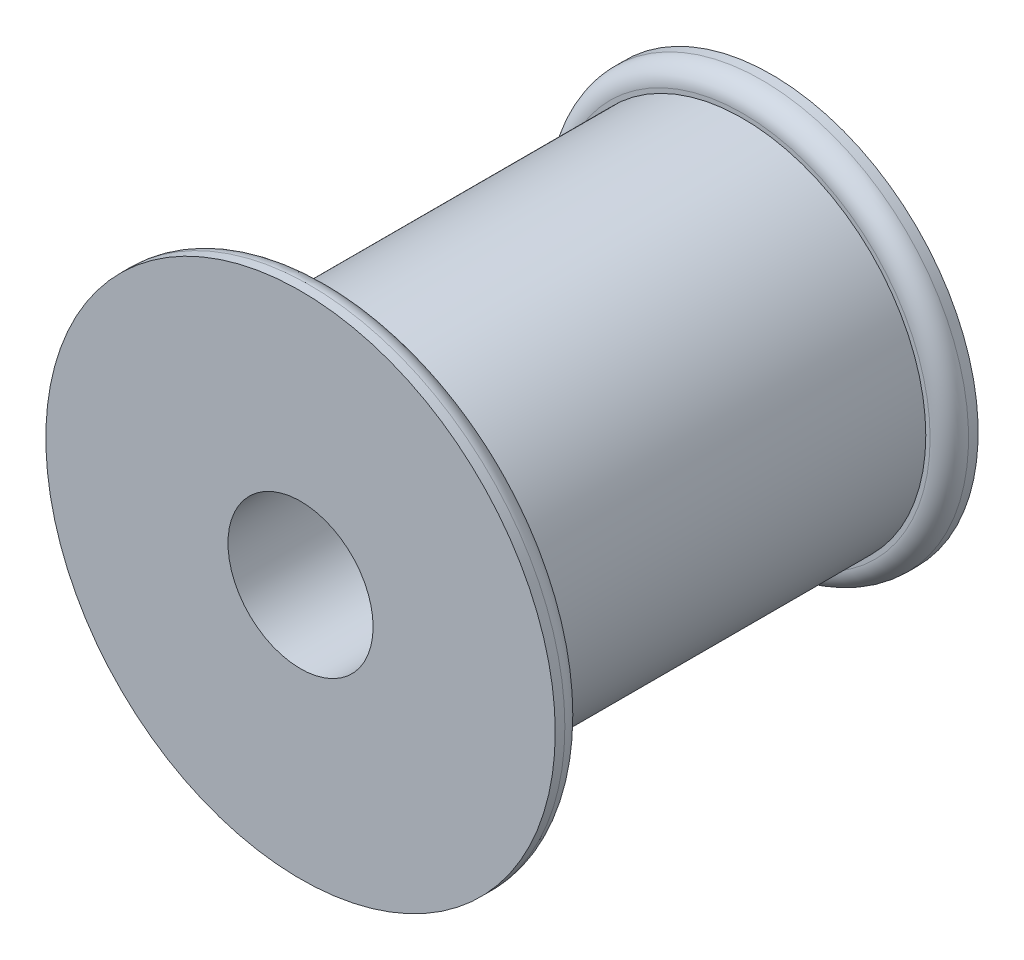
ISO-10303-21;
HEADER;
FILE_DESCRIPTION(('STEP AP214'),'2;1');
FILE_NAME('part.step','',(''),(''),'','','');
FILE_SCHEMA(('AUTOMOTIVE_DESIGN { 1 0 10303 214 1 1 1 1 }'));
ENDSEC;
DATA;
#1=APPLICATION_CONTEXT('core data for automotive mechanical design processes');
#2=APPLICATION_PROTOCOL_DEFINITION('international standard','automotive_design',2000,#1);
#3=PRODUCT_CONTEXT('',#1,'mechanical');
#4=PRODUCT('Part','Part','',(#3));
#5=PRODUCT_RELATED_PRODUCT_CATEGORY('part','',(#4));
#6=PRODUCT_DEFINITION_FORMATION('','',#4);
#7=PRODUCT_DEFINITION_CONTEXT('part definition',#1,'design');
#8=PRODUCT_DEFINITION('design','',#6,#7);
#9=PRODUCT_DEFINITION_SHAPE('','',#8);
#10=(LENGTH_UNIT() NAMED_UNIT(*) SI_UNIT(.MILLI.,.METRE.));
#11=(NAMED_UNIT(*) PLANE_ANGLE_UNIT() SI_UNIT($,.RADIAN.));
#12=(NAMED_UNIT(*) SI_UNIT($,.STERADIAN.) SOLID_ANGLE_UNIT());
#13=UNCERTAINTY_MEASURE_WITH_UNIT(LENGTH_MEASURE(1.E-05),#10,'distance_accuracy_value','');
#14=(GEOMETRIC_REPRESENTATION_CONTEXT(3) GLOBAL_UNCERTAINTY_ASSIGNED_CONTEXT((#13)) GLOBAL_UNIT_ASSIGNED_CONTEXT((#10,
#11,#12)) REPRESENTATION_CONTEXT('',''));
#15=CARTESIAN_POINT('',(0.,0.,0.));
#16=DIRECTION('',(0.,0.,1.));
#17=DIRECTION('',(1.,0.,0.));
#18=AXIS2_PLACEMENT_3D('',#15,#16,#17);
#19=CARTESIAN_POINT('',(0.,0.,-2.));
#20=DIRECTION('',(0.,0.,-1.));
#21=DIRECTION('',(-1.,0.,0.));
#22=AXIS2_PLACEMENT_3D('',#19,#20,#21);
#23=TOROIDAL_SURFACE('',#22,19.5,2.);
#24=CARTESIAN_POINT('',(0.,0.,0.));
#25=DIRECTION('',(0.,0.,-1.));
#26=DIRECTION('',(-1.,0.,0.));
#27=AXIS2_PLACEMENT_3D('',#24,#25,#26);
#28=CIRCLE('',#27,19.5);
#29=CARTESIAN_POINT('',(-19.5,0.,0.));
#30=VERTEX_POINT('',#29);
#31=EDGE_CURVE('E43',#30,#30,#28,.F.);
#32=ORIENTED_EDGE('',*,*,#31,.F.);
#33=EDGE_LOOP('',(#32));
#34=FACE_BOUND('',#33,.T.);
#35=CARTESIAN_POINT('',(0.,0.,-2.));
#36=DIRECTION('',(0.,0.,-1.));
#37=DIRECTION('',(-1.,0.,0.));
#38=AXIS2_PLACEMENT_3D('',#35,#36,#37);
#39=CIRCLE('',#38,21.5);
#40=CARTESIAN_POINT('',(-21.5,0.,-2.));
#41=VERTEX_POINT('',#40);
#42=EDGE_CURVE('E10',#41,#41,#39,.T.);
#43=ORIENTED_EDGE('',*,*,#42,.F.);
#44=EDGE_LOOP('',(#43));
#45=FACE_BOUND('',#44,.T.);
#46=ADVANCED_FACE('F37',(#34,#45),#23,.T.);
#47=CARTESIAN_POINT('',(0.,0.,45.));
#48=DIRECTION('',(0.,0.,1.));
#49=DIRECTION('',(1.,0.,0.));
#50=AXIS2_PLACEMENT_3D('',#47,#48,#49);
#51=TOROIDAL_SURFACE('',#50,24.5,2.);
#52=CARTESIAN_POINT('',(0.,0.,43.));
#53=DIRECTION('',(0.,0.,1.));
#54=DIRECTION('',(1.,0.,0.));
#55=AXIS2_PLACEMENT_3D('',#52,#53,#54);
#56=CIRCLE('',#55,24.5);
#57=CARTESIAN_POINT('',(24.5,0.,43.));
#58=VERTEX_POINT('',#57);
#59=EDGE_CURVE('E51',#58,#58,#56,.F.);
#60=ORIENTED_EDGE('',*,*,#59,.F.);
#61=EDGE_LOOP('',(#60));
#62=FACE_BOUND('',#61,.T.);
#63=CARTESIAN_POINT('',(0.,0.,45.));
#64=DIRECTION('',(0.,0.,1.));
#65=DIRECTION('',(1.,0.,0.));
#66=AXIS2_PLACEMENT_3D('',#63,#64,#65);
#67=CIRCLE('',#66,26.5);
#68=CARTESIAN_POINT('',(26.5,0.,45.));
#69=VERTEX_POINT('',#68);
#70=EDGE_CURVE('E47',#69,#69,#67,.T.);
#71=ORIENTED_EDGE('',*,*,#70,.F.);
#72=EDGE_LOOP('',(#71));
#73=FACE_BOUND('',#72,.T.);
#74=ADVANCED_FACE('F113',(#62,#73),#51,.T.);
#75=CARTESIAN_POINT('',(0.,0.,43.));
#76=DIRECTION('',(0.,0.,-1.));
#77=DIRECTION('',(-1.,0.,0.));
#78=AXIS2_PLACEMENT_3D('',#75,#76,#77);
#79=CYLINDRICAL_SURFACE('',#78,4.14);
#80=CARTESIAN_POINT('',(0.,0.,-3.));
#81=DIRECTION('',(0.,0.,-1.));
#82=DIRECTION('',(-1.,0.,0.));
#83=AXIS2_PLACEMENT_3D('',#80,#81,#82);
#84=CIRCLE('',#83,4.14);
#85=CARTESIAN_POINT('',(-4.14,0.,-3.));
#86=VERTEX_POINT('',#85);
#87=EDGE_CURVE('E60',#86,#86,#84,.T.);
#88=ORIENTED_EDGE('',*,*,#87,.T.);
#89=EDGE_LOOP('',(#88));
#90=FACE_BOUND('',#89,.T.);
#91=CARTESIAN_POINT('',(0.,0.,31.));
#92=DIRECTION('',(0.,0.,1.));
#93=DIRECTION('',(1.,0.,0.));
#94=AXIS2_PLACEMENT_3D('',#91,#92,#93);
#95=CIRCLE('',#94,4.14);
#96=CARTESIAN_POINT('',(4.14,0.,31.));
#97=VERTEX_POINT('',#96);
#98=EDGE_CURVE('E57',#97,#97,#95,.T.);
#99=ORIENTED_EDGE('',*,*,#98,.T.);
#100=EDGE_LOOP('',(#99));
#101=FACE_BOUND('',#100,.T.);
#102=ADVANCED_FACE('F107',(#90,#101),#79,.F.);
#103=CARTESIAN_POINT('',(0.,0.,43.));
#104=DIRECTION('',(0.,0.,-1.));
#105=DIRECTION('',(-1.,0.,0.));
#106=AXIS2_PLACEMENT_3D('',#103,#104,#105);
#107=CYLINDRICAL_SURFACE('',#106,19.05);
#108=CARTESIAN_POINT('',(0.,0.,43.));
#109=DIRECTION('',(0.,0.,1.));
#110=DIRECTION('',(1.,0.,0.));
#111=AXIS2_PLACEMENT_3D('',#108,#109,#110);
#112=CIRCLE('',#111,19.05);
#113=CARTESIAN_POINT('',(19.05,0.,43.));
#114=VERTEX_POINT('',#113);
#115=EDGE_CURVE('E56',#114,#114,#112,.T.);
#116=ORIENTED_EDGE('',*,*,#115,.F.);
#117=EDGE_LOOP('',(#116));
#118=FACE_BOUND('',#117,.T.);
#119=CARTESIAN_POINT('',(0.,0.,0.));
#120=DIRECTION('',(0.,0.,1.));
#121=DIRECTION('',(1.,0.,0.));
#122=AXIS2_PLACEMENT_3D('',#119,#120,#121);
#123=CIRCLE('',#122,19.05);
#124=CARTESIAN_POINT('',(19.05,0.,0.));
#125=VERTEX_POINT('',#124);
#126=EDGE_CURVE('E62',#125,#125,#123,.T.);
#127=ORIENTED_EDGE('',*,*,#126,.T.);
#128=EDGE_LOOP('',(#127));
#129=FACE_BOUND('',#128,.T.);
#130=ADVANCED_FACE('F99',(#118,#129),#107,.T.);
#131=CARTESIAN_POINT('',(0.,0.,46.));
#132=DIRECTION('',(0.,0.,-1.));
#133=DIRECTION('',(-1.,0.,0.));
#134=AXIS2_PLACEMENT_3D('',#131,#132,#133);
#135=CYLINDRICAL_SURFACE('',#134,26.5);
#136=ORIENTED_EDGE('',*,*,#70,.T.);
#137=EDGE_LOOP('',(#136));
#138=FACE_BOUND('',#137,.T.);
#139=CARTESIAN_POINT('',(0.,0.,46.));
#140=DIRECTION('',(0.,0.,1.));
#141=DIRECTION('',(1.,0.,0.));
#142=AXIS2_PLACEMENT_3D('',#139,#140,#141);
#143=CIRCLE('',#142,26.5);
#144=CARTESIAN_POINT('',(26.5,0.,46.));
#145=VERTEX_POINT('',#144);
#146=EDGE_CURVE('E65',#145,#145,#143,.T.);
#147=ORIENTED_EDGE('',*,*,#146,.F.);
#148=EDGE_LOOP('',(#147));
#149=FACE_BOUND('',#148,.T.);
#150=ADVANCED_FACE('F94',(#138,#149),#135,.T.);
#151=CARTESIAN_POINT('',(0.,0.,46.));
#152=DIRECTION('',(0.,0.,1.));
#153=DIRECTION('',(1.,0.,0.));
#154=AXIS2_PLACEMENT_3D('',#151,#152,#153);
#155=PLANE('',#154);
#156=CARTESIAN_POINT('',(0.,0.,46.));
#157=DIRECTION('',(0.,0.,1.));
#158=DIRECTION('',(1.,0.,0.));
#159=AXIS2_PLACEMENT_3D('',#156,#157,#158);
#160=CIRCLE('',#159,7.55);
#161=CARTESIAN_POINT('',(7.55,0.,46.));
#162=VERTEX_POINT('',#161);
#163=EDGE_CURVE('E75',#162,#162,#160,.T.);
#164=ORIENTED_EDGE('',*,*,#163,.F.);
#165=EDGE_LOOP('',(#164));
#166=FACE_BOUND('',#165,.T.);
#167=ORIENTED_EDGE('',*,*,#146,.T.);
#168=EDGE_LOOP('',(#167));
#169=FACE_BOUND('',#168,.T.);
#170=ADVANCED_FACE('F90',(#166,#169),#155,.T.);
#171=CARTESIAN_POINT('',(0.,0.,43.));
#172=DIRECTION('',(0.,0.,1.));
#173=DIRECTION('',(1.,0.,0.));
#174=AXIS2_PLACEMENT_3D('',#171,#172,#173);
#175=PLANE('',#174);
#176=ORIENTED_EDGE('',*,*,#59,.T.);
#177=EDGE_LOOP('',(#176));
#178=FACE_BOUND('',#177,.T.);
#179=ORIENTED_EDGE('',*,*,#115,.T.);
#180=EDGE_LOOP('',(#179));
#181=FACE_BOUND('',#180,.T.);
#182=ADVANCED_FACE('F93',(#178,#181),#175,.F.);
#183=CARTESIAN_POINT('',(0.,0.,-3.));
#184=DIRECTION('',(0.,0.,-1.));
#185=DIRECTION('',(-1.,0.,0.));
#186=AXIS2_PLACEMENT_3D('',#183,#184,#185);
#187=PLANE('',#186);
#188=CARTESIAN_POINT('',(0.,0.,-3.));
#189=DIRECTION('',(0.,0.,-1.));
#190=DIRECTION('',(-1.,0.,0.));
#191=AXIS2_PLACEMENT_3D('',#188,#189,#190);
#192=CIRCLE('',#191,21.5);
#193=CARTESIAN_POINT('',(-21.5,0.,-3.));
#194=VERTEX_POINT('',#193);
#195=EDGE_CURVE('E66',#194,#194,#192,.T.);
#196=ORIENTED_EDGE('',*,*,#195,.T.);
#197=EDGE_LOOP('',(#196));
#198=FACE_BOUND('',#197,.T.);
#199=ORIENTED_EDGE('',*,*,#87,.F.);
#200=EDGE_LOOP('',(#199));
#201=FACE_BOUND('',#200,.T.);
#202=ADVANCED_FACE('F130',(#198,#201),#187,.T.);
#203=CARTESIAN_POINT('',(0.,0.,0.));
#204=DIRECTION('',(0.,0.,-1.));
#205=DIRECTION('',(-1.,0.,0.));
#206=AXIS2_PLACEMENT_3D('',#203,#204,#205);
#207=PLANE('',#206);
#208=ORIENTED_EDGE('',*,*,#31,.T.);
#209=EDGE_LOOP('',(#208));
#210=FACE_BOUND('',#209,.T.);
#211=ORIENTED_EDGE('',*,*,#126,.F.);
#212=EDGE_LOOP('',(#211));
#213=FACE_BOUND('',#212,.T.);
#214=ADVANCED_FACE('F135',(#210,#213),#207,.F.);
#215=CARTESIAN_POINT('',(0.,0.,-3.));
#216=DIRECTION('',(0.,0.,1.));
#217=DIRECTION('',(1.,0.,0.));
#218=AXIS2_PLACEMENT_3D('',#215,#216,#217);
#219=CYLINDRICAL_SURFACE('',#218,21.5);
#220=ORIENTED_EDGE('',*,*,#42,.T.);
#221=EDGE_LOOP('',(#220));
#222=FACE_BOUND('',#221,.T.);
#223=ORIENTED_EDGE('',*,*,#195,.F.);
#224=EDGE_LOOP('',(#223));
#225=FACE_BOUND('',#224,.T.);
#226=ADVANCED_FACE('F86',(#222,#225),#219,.T.);
#227=CARTESIAN_POINT('',(0.,0.,31.));
#228=DIRECTION('',(0.,0.,1.));
#229=DIRECTION('',(1.,0.,0.));
#230=AXIS2_PLACEMENT_3D('',#227,#228,#229);
#231=CYLINDRICAL_SURFACE('',#230,7.55);
#232=CARTESIAN_POINT('',(0.,0.,31.));
#233=DIRECTION('',(0.,0.,1.));
#234=DIRECTION('',(1.,0.,0.));
#235=AXIS2_PLACEMENT_3D('',#232,#233,#234);
#236=CIRCLE('',#235,7.55);
#237=CARTESIAN_POINT('',(7.55,0.,31.));
#238=VERTEX_POINT('',#237);
#239=EDGE_CURVE('E61',#238,#238,#236,.T.);
#240=ORIENTED_EDGE('',*,*,#239,.F.);
#241=EDGE_LOOP('',(#240));
#242=FACE_BOUND('',#241,.T.);
#243=ORIENTED_EDGE('',*,*,#163,.T.);
#244=EDGE_LOOP('',(#243));
#245=FACE_BOUND('',#244,.T.);
#246=ADVANCED_FACE('F83',(#242,#245),#231,.F.);
#247=CARTESIAN_POINT('',(0.,0.,31.));
#248=DIRECTION('',(0.,0.,1.));
#249=DIRECTION('',(1.,0.,0.));
#250=AXIS2_PLACEMENT_3D('',#247,#248,#249);
#251=PLANE('',#250);
#252=ORIENTED_EDGE('',*,*,#98,.F.);
#253=EDGE_LOOP('',(#252));
#254=FACE_BOUND('',#253,.T.);
#255=ORIENTED_EDGE('',*,*,#239,.T.);
#256=EDGE_LOOP('',(#255));
#257=FACE_BOUND('',#256,.T.);
#258=ADVANCED_FACE('F81',(#254,#257),#251,.T.);
#259=CLOSED_SHELL('',(#46,#74,#102,#130,#150,#170,#182,#202,#214,#226,#246,#258));
#260=MANIFOLD_SOLID_BREP('B2',#259);
#261=ADVANCED_BREP_SHAPE_REPRESENTATION('',(#18,#260),#14);
#262=SHAPE_DEFINITION_REPRESENTATION(#9,#261);
ENDSEC;
END-ISO-10303-21;
